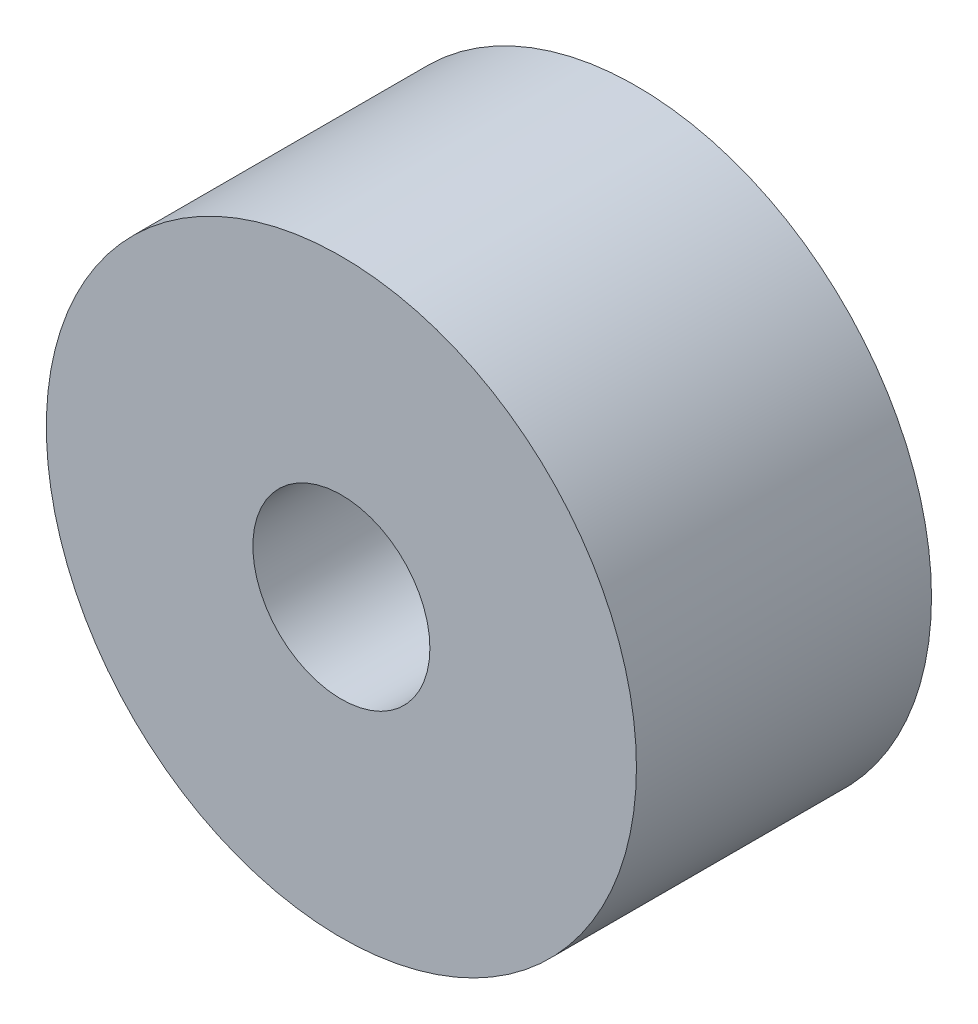
ISO-10303-21;
HEADER;
FILE_DESCRIPTION(('STEP AP214'),'2;1');
FILE_NAME('part.step','',(''),(''),'','','');
FILE_SCHEMA(('AUTOMOTIVE_DESIGN { 1 0 10303 214 1 1 1 1 }'));
ENDSEC;
DATA;
#1=APPLICATION_CONTEXT('core data for automotive mechanical design processes');
#2=APPLICATION_PROTOCOL_DEFINITION('international standard','automotive_design',2000,#1);
#3=PRODUCT_CONTEXT('',#1,'mechanical');
#4=PRODUCT('Part','Part','',(#3));
#5=PRODUCT_RELATED_PRODUCT_CATEGORY('part','',(#4));
#6=PRODUCT_DEFINITION_FORMATION('','',#4);
#7=PRODUCT_DEFINITION_CONTEXT('part definition',#1,'design');
#8=PRODUCT_DEFINITION('design','',#6,#7);
#9=PRODUCT_DEFINITION_SHAPE('','',#8);
#10=(LENGTH_UNIT() NAMED_UNIT(*) SI_UNIT(.MILLI.,.METRE.));
#11=(NAMED_UNIT(*) PLANE_ANGLE_UNIT() SI_UNIT($,.RADIAN.));
#12=(NAMED_UNIT(*) SI_UNIT($,.STERADIAN.) SOLID_ANGLE_UNIT());
#13=UNCERTAINTY_MEASURE_WITH_UNIT(LENGTH_MEASURE(1.E-05),#10,'distance_accuracy_value','');
#14=(GEOMETRIC_REPRESENTATION_CONTEXT(3) GLOBAL_UNCERTAINTY_ASSIGNED_CONTEXT((#13)) GLOBAL_UNIT_ASSIGNED_CONTEXT((#10,
#11,#12)) REPRESENTATION_CONTEXT('',''));
#15=CARTESIAN_POINT('',(0.,0.,0.));
#16=DIRECTION('',(0.,0.,1.));
#17=DIRECTION('',(1.,0.,0.));
#18=AXIS2_PLACEMENT_3D('',#15,#16,#17);
#19=CARTESIAN_POINT('',(0.,0.,5.));
#20=DIRECTION('',(0.,0.,1.));
#21=DIRECTION('',(1.,0.,0.));
#22=AXIS2_PLACEMENT_3D('',#19,#20,#21);
#23=PLANE('',#22);
#24=CARTESIAN_POINT('',(0.,0.,5.));
#25=DIRECTION('',(0.,0.,1.));
#26=DIRECTION('',(1.,0.,0.));
#27=AXIS2_PLACEMENT_3D('',#24,#25,#26);
#28=CIRCLE('',#27,5.);
#29=CARTESIAN_POINT('',(5.,0.,5.));
#30=VERTEX_POINT('',#29);
#31=EDGE_CURVE('E10',#30,#30,#28,.T.);
#32=ORIENTED_EDGE('',*,*,#31,.T.);
#33=EDGE_LOOP('',(#32));
#34=FACE_BOUND('',#33,.T.);
#35=CARTESIAN_POINT('',(0.,0.,5.));
#36=DIRECTION('',(0.,0.,1.));
#37=DIRECTION('',(1.,0.,0.));
#38=AXIS2_PLACEMENT_3D('',#35,#36,#37);
#39=CIRCLE('',#38,1.5);
#40=CARTESIAN_POINT('',(1.5,0.,5.));
#41=VERTEX_POINT('',#40);
#42=EDGE_CURVE('E43',#41,#41,#39,.T.);
#43=ORIENTED_EDGE('',*,*,#42,.F.);
#44=EDGE_LOOP('',(#43));
#45=FACE_BOUND('',#44,.T.);
#46=ADVANCED_FACE('F32',(#34,#45),#23,.T.);
#47=CARTESIAN_POINT('',(0.,0.,0.));
#48=DIRECTION('',(0.,0.,1.));
#49=DIRECTION('',(1.,0.,0.));
#50=AXIS2_PLACEMENT_3D('',#47,#48,#49);
#51=PLANE('',#50);
#52=CARTESIAN_POINT('',(0.,0.,0.));
#53=DIRECTION('',(0.,0.,1.));
#54=DIRECTION('',(1.,0.,0.));
#55=AXIS2_PLACEMENT_3D('',#52,#53,#54);
#56=CIRCLE('',#55,5.);
#57=CARTESIAN_POINT('',(5.,0.,0.));
#58=VERTEX_POINT('',#57);
#59=EDGE_CURVE('E36',#58,#58,#56,.T.);
#60=ORIENTED_EDGE('',*,*,#59,.F.);
#61=EDGE_LOOP('',(#60));
#62=FACE_BOUND('',#61,.T.);
#63=CARTESIAN_POINT('',(0.,0.,0.));
#64=DIRECTION('',(0.,0.,1.));
#65=DIRECTION('',(1.,0.,0.));
#66=AXIS2_PLACEMENT_3D('',#63,#64,#65);
#67=CIRCLE('',#66,1.5);
#68=CARTESIAN_POINT('',(1.5,0.,0.));
#69=VERTEX_POINT('',#68);
#70=EDGE_CURVE('E45',#69,#69,#67,.T.);
#71=ORIENTED_EDGE('',*,*,#70,.T.);
#72=EDGE_LOOP('',(#71));
#73=FACE_BOUND('',#72,.T.);
#74=ADVANCED_FACE('F55',(#62,#73),#51,.F.);
#75=CARTESIAN_POINT('',(0.,0.,5.));
#76=DIRECTION('',(0.,0.,-1.));
#77=DIRECTION('',(-1.,0.,0.));
#78=AXIS2_PLACEMENT_3D('',#75,#76,#77);
#79=CYLINDRICAL_SURFACE('',#78,5.);
#80=ORIENTED_EDGE('',*,*,#31,.F.);
#81=EDGE_LOOP('',(#80));
#82=FACE_BOUND('',#81,.T.);
#83=ORIENTED_EDGE('',*,*,#59,.T.);
#84=EDGE_LOOP('',(#83));
#85=FACE_BOUND('',#84,.T.);
#86=ADVANCED_FACE('F34',(#82,#85),#79,.T.);
#87=CARTESIAN_POINT('',(0.,0.,5.));
#88=DIRECTION('',(0.,0.,-1.));
#89=DIRECTION('',(-1.,0.,0.));
#90=AXIS2_PLACEMENT_3D('',#87,#88,#89);
#91=CYLINDRICAL_SURFACE('',#90,1.5);
#92=ORIENTED_EDGE('',*,*,#42,.T.);
#93=EDGE_LOOP('',(#92));
#94=FACE_BOUND('',#93,.T.);
#95=ORIENTED_EDGE('',*,*,#70,.F.);
#96=EDGE_LOOP('',(#95));
#97=FACE_BOUND('',#96,.T.);
#98=ADVANCED_FACE('F51',(#94,#97),#91,.F.);
#99=CLOSED_SHELL('',(#46,#74,#86,#98));
#100=MANIFOLD_SOLID_BREP('B2',#99);
#101=ADVANCED_BREP_SHAPE_REPRESENTATION('',(#18,#100),#14);
#102=SHAPE_DEFINITION_REPRESENTATION(#9,#101);
ENDSEC;
END-ISO-10303-21;
